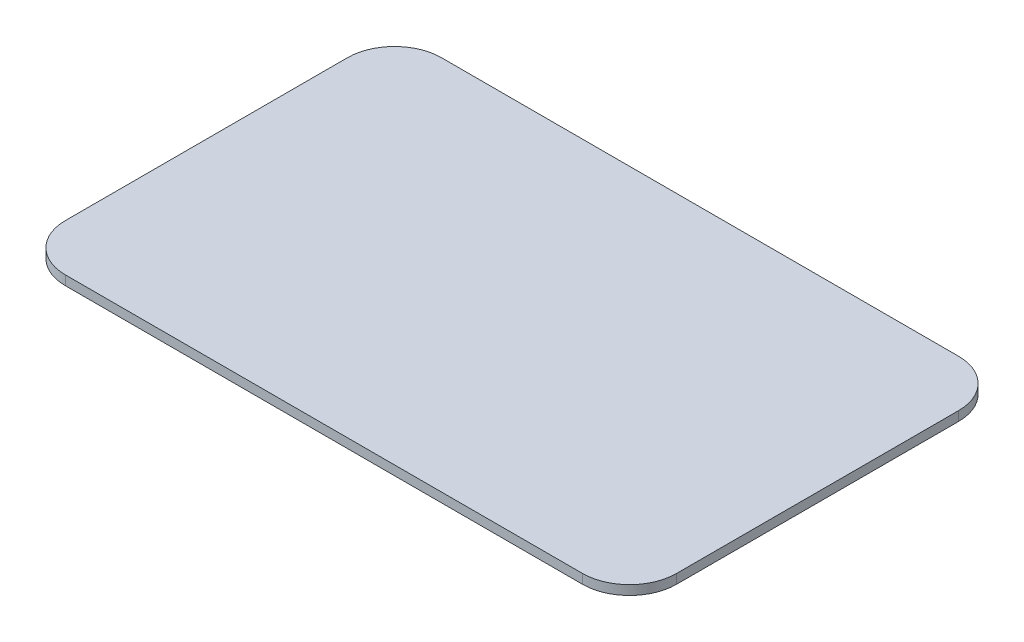
ISO-10303-21;
HEADER;
FILE_DESCRIPTION(('STEP AP214'),'2;1');
FILE_NAME('part.step','',(''),(''),'','','');
FILE_SCHEMA(('AUTOMOTIVE_DESIGN { 1 0 10303 214 1 1 1 1 }'));
ENDSEC;
DATA;
#1=APPLICATION_CONTEXT('core data for automotive mechanical design processes');
#2=APPLICATION_PROTOCOL_DEFINITION('international standard','automotive_design',2000,#1);
#3=PRODUCT_CONTEXT('',#1,'mechanical');
#4=PRODUCT('Part','Part','',(#3));
#5=PRODUCT_RELATED_PRODUCT_CATEGORY('part','',(#4));
#6=PRODUCT_DEFINITION_FORMATION('','',#4);
#7=PRODUCT_DEFINITION_CONTEXT('part definition',#1,'design');
#8=PRODUCT_DEFINITION('design','',#6,#7);
#9=PRODUCT_DEFINITION_SHAPE('','',#8);
#10=(LENGTH_UNIT() NAMED_UNIT(*) SI_UNIT(.MILLI.,.METRE.));
#11=(NAMED_UNIT(*) PLANE_ANGLE_UNIT() SI_UNIT($,.RADIAN.));
#12=(NAMED_UNIT(*) SI_UNIT($,.STERADIAN.) SOLID_ANGLE_UNIT());
#13=UNCERTAINTY_MEASURE_WITH_UNIT(LENGTH_MEASURE(1.E-05),#10,'distance_accuracy_value','');
#14=(GEOMETRIC_REPRESENTATION_CONTEXT(3) GLOBAL_UNCERTAINTY_ASSIGNED_CONTEXT((#13)) GLOBAL_UNIT_ASSIGNED_CONTEXT((#10,
#11,#12)) REPRESENTATION_CONTEXT('',''));
#15=CARTESIAN_POINT('',(0.,0.,0.));
#16=DIRECTION('',(0.,0.,1.));
#17=DIRECTION('',(1.,0.,0.));
#18=AXIS2_PLACEMENT_3D('',#15,#16,#17);
#19=CARTESIAN_POINT('',(-54.5065891010215,2.,30.328940599319));
#20=DIRECTION('',(0.,-1.,0.));
#21=DIRECTION('',(0.,0.,-1.));
#22=AXIS2_PLACEMENT_3D('',#19,#20,#21);
#23=CYLINDRICAL_SURFACE('',#22,10.);
#24=CARTESIAN_POINT('',(-54.5065891010215,0.,30.328940599319));
#25=DIRECTION('',(0.,1.,0.));
#26=DIRECTION('',(0.,0.,1.));
#27=AXIS2_PLACEMENT_3D('',#24,#25,#26);
#28=CIRCLE('',#27,10.);
#29=CARTESIAN_POINT('',(-64.5065891010215,0.,30.3289405993189));
#30=VERTEX_POINT('',#29);
#31=CARTESIAN_POINT('',(-54.5065891010214,0.,40.328940599319));
#32=VERTEX_POINT('',#31);
#33=EDGE_CURVE('E134',#30,#32,#28,.T.);
#34=ORIENTED_EDGE('',*,*,#33,.T.);
#35=DIRECTION('',(0.,-1.,0.));
#36=VECTOR('',#35,1.);
#37=CARTESIAN_POINT('',(-54.5065891010214,2.,40.328940599319));
#38=LINE('',#37,#36);
#39=CARTESIAN_POINT('',(-54.5065891010214,2.,40.328940599319));
#40=VERTEX_POINT('',#39);
#41=EDGE_CURVE('E11',#40,#32,#38,.T.);
#42=ORIENTED_EDGE('',*,*,#41,.F.);
#43=CARTESIAN_POINT('',(-54.5065891010215,2.,30.328940599319));
#44=DIRECTION('',(0.,1.,0.));
#45=DIRECTION('',(0.,0.,1.));
#46=AXIS2_PLACEMENT_3D('',#43,#44,#45);
#47=CIRCLE('',#46,10.);
#48=CARTESIAN_POINT('',(-64.5065891010215,2.,30.3289405993189));
#49=VERTEX_POINT('',#48);
#50=EDGE_CURVE('E146',#49,#40,#47,.T.);
#51=ORIENTED_EDGE('',*,*,#50,.F.);
#52=DIRECTION('',(0.,-1.,0.));
#53=VECTOR('',#52,1.);
#54=CARTESIAN_POINT('',(-64.5065891010215,2.,30.3289405993189));
#55=LINE('',#54,#53);
#56=EDGE_CURVE('E131',#49,#30,#55,.T.);
#57=ORIENTED_EDGE('',*,*,#56,.T.);
#58=EDGE_LOOP('',(#34,#42,#51,#57));
#59=FACE_BOUND('',#58,.T.);
#60=ADVANCED_FACE('F39',(#59),#23,.T.);
#61=CARTESIAN_POINT('',(-54.5065891010214,2.,40.328940599319));
#62=DIRECTION('',(0.,0.,-1.));
#63=DIRECTION('',(-1.,0.,0.));
#64=AXIS2_PLACEMENT_3D('',#61,#62,#63);
#65=PLANE('',#64);
#66=DIRECTION('',(1.,0.,0.));
#67=VECTOR('',#66,1.);
#68=CARTESIAN_POINT('',(-54.5065891010214,0.,40.328940599319));
#69=LINE('',#68,#67);
#70=CARTESIAN_POINT('',(55.4934108989785,0.,40.328940599319));
#71=VERTEX_POINT('',#70);
#72=EDGE_CURVE('E138',#32,#71,#69,.T.);
#73=ORIENTED_EDGE('',*,*,#72,.T.);
#74=DIRECTION('',(0.,-1.,0.));
#75=VECTOR('',#74,1.);
#76=CARTESIAN_POINT('',(55.4934108989785,2.,40.328940599319));
#77=LINE('',#76,#75);
#78=CARTESIAN_POINT('',(55.4934108989785,2.,40.328940599319));
#79=VERTEX_POINT('',#78);
#80=EDGE_CURVE('E50',#79,#71,#77,.T.);
#81=ORIENTED_EDGE('',*,*,#80,.F.);
#82=DIRECTION('',(1.,0.,0.));
#83=VECTOR('',#82,1.);
#84=CARTESIAN_POINT('',(-54.5065891010214,2.,40.328940599319));
#85=LINE('',#84,#83);
#86=EDGE_CURVE('E97',#40,#79,#85,.T.);
#87=ORIENTED_EDGE('',*,*,#86,.F.);
#88=ORIENTED_EDGE('',*,*,#41,.T.);
#89=EDGE_LOOP('',(#73,#81,#87,#88));
#90=FACE_BOUND('',#89,.T.);
#91=ADVANCED_FACE('F182',(#90),#65,.F.);
#92=CARTESIAN_POINT('',(55.4934108989785,2.,30.328940599319));
#93=DIRECTION('',(0.,-1.,0.));
#94=DIRECTION('',(0.,0.,-1.));
#95=AXIS2_PLACEMENT_3D('',#92,#93,#94);
#96=CYLINDRICAL_SURFACE('',#95,10.);
#97=CARTESIAN_POINT('',(55.4934108989785,0.,30.328940599319));
#98=DIRECTION('',(0.,1.,0.));
#99=DIRECTION('',(0.,0.,1.));
#100=AXIS2_PLACEMENT_3D('',#97,#98,#99);
#101=CIRCLE('',#100,10.);
#102=CARTESIAN_POINT('',(65.4934108989785,0.,30.3289405993189));
#103=VERTEX_POINT('',#102);
#104=EDGE_CURVE('E139',#71,#103,#101,.T.);
#105=ORIENTED_EDGE('',*,*,#104,.T.);
#106=DIRECTION('',(0.,-1.,0.));
#107=VECTOR('',#106,1.);
#108=CARTESIAN_POINT('',(65.4934108989785,2.,30.3289405993189));
#109=LINE('',#108,#107);
#110=CARTESIAN_POINT('',(65.4934108989785,2.,30.3289405993189));
#111=VERTEX_POINT('',#110);
#112=EDGE_CURVE('E157',#111,#103,#109,.T.);
#113=ORIENTED_EDGE('',*,*,#112,.F.);
#114=CARTESIAN_POINT('',(55.4934108989785,2.,30.328940599319));
#115=DIRECTION('',(0.,1.,0.));
#116=DIRECTION('',(0.,0.,1.));
#117=AXIS2_PLACEMENT_3D('',#114,#115,#116);
#118=CIRCLE('',#117,10.);
#119=EDGE_CURVE('E163',#79,#111,#118,.T.);
#120=ORIENTED_EDGE('',*,*,#119,.F.);
#121=ORIENTED_EDGE('',*,*,#80,.T.);
#122=EDGE_LOOP('',(#105,#113,#120,#121));
#123=FACE_BOUND('',#122,.T.);
#124=ADVANCED_FACE('F162',(#123),#96,.T.);
#125=CARTESIAN_POINT('',(65.4934108989785,2.,30.3289405993189));
#126=DIRECTION('',(-1.,0.,0.));
#127=DIRECTION('',(0.,0.,1.));
#128=AXIS2_PLACEMENT_3D('',#125,#126,#127);
#129=PLANE('',#128);
#130=DIRECTION('',(0.,0.,-1.));
#131=VECTOR('',#130,1.);
#132=CARTESIAN_POINT('',(65.4934108989785,0.,30.3289405993189));
#133=LINE('',#132,#131);
#134=CARTESIAN_POINT('',(65.4934108989785,0.,-29.6710594006809));
#135=VERTEX_POINT('',#134);
#136=EDGE_CURVE('E145',#103,#135,#133,.T.);
#137=ORIENTED_EDGE('',*,*,#136,.T.);
#138=DIRECTION('',(0.,-1.,0.));
#139=VECTOR('',#138,1.);
#140=CARTESIAN_POINT('',(65.4934108989785,2.,-29.6710594006809));
#141=LINE('',#140,#139);
#142=CARTESIAN_POINT('',(65.4934108989785,2.,-29.6710594006809));
#143=VERTEX_POINT('',#142);
#144=EDGE_CURVE('E154',#143,#135,#141,.T.);
#145=ORIENTED_EDGE('',*,*,#144,.F.);
#146=DIRECTION('',(0.,0.,-1.));
#147=VECTOR('',#146,1.);
#148=CARTESIAN_POINT('',(65.4934108989785,2.,30.3289405993189));
#149=LINE('',#148,#147);
#150=EDGE_CURVE('E176',#111,#143,#149,.T.);
#151=ORIENTED_EDGE('',*,*,#150,.F.);
#152=ORIENTED_EDGE('',*,*,#112,.T.);
#153=EDGE_LOOP('',(#137,#145,#151,#152));
#154=FACE_BOUND('',#153,.T.);
#155=ADVANCED_FACE('F175',(#154),#129,.F.);
#156=CARTESIAN_POINT('',(55.4934108989785,2.,-29.671059400681));
#157=DIRECTION('',(0.,-1.,0.));
#158=DIRECTION('',(0.,0.,-1.));
#159=AXIS2_PLACEMENT_3D('',#156,#157,#158);
#160=CYLINDRICAL_SURFACE('',#159,10.);
#161=CARTESIAN_POINT('',(55.4934108989785,0.,-29.671059400681));
#162=DIRECTION('',(0.,1.,0.));
#163=DIRECTION('',(0.,0.,1.));
#164=AXIS2_PLACEMENT_3D('',#161,#162,#163);
#165=CIRCLE('',#164,10.);
#166=CARTESIAN_POINT('',(55.4934108989785,0.,-39.671059400681));
#167=VERTEX_POINT('',#166);
#168=EDGE_CURVE('E143',#135,#167,#165,.T.);
#169=ORIENTED_EDGE('',*,*,#168,.T.);
#170=DIRECTION('',(0.,-1.,0.));
#171=VECTOR('',#170,1.);
#172=CARTESIAN_POINT('',(55.4934108989785,2.,-39.671059400681));
#173=LINE('',#172,#171);
#174=CARTESIAN_POINT('',(55.4934108989785,2.,-39.671059400681));
#175=VERTEX_POINT('',#174);
#176=EDGE_CURVE('E128',#175,#167,#173,.T.);
#177=ORIENTED_EDGE('',*,*,#176,.F.);
#178=CARTESIAN_POINT('',(55.4934108989785,2.,-29.671059400681));
#179=DIRECTION('',(0.,1.,0.));
#180=DIRECTION('',(0.,0.,1.));
#181=AXIS2_PLACEMENT_3D('',#178,#179,#180);
#182=CIRCLE('',#181,10.);
#183=EDGE_CURVE('E117',#143,#175,#182,.T.);
#184=ORIENTED_EDGE('',*,*,#183,.F.);
#185=ORIENTED_EDGE('',*,*,#144,.T.);
#186=EDGE_LOOP('',(#169,#177,#184,#185));
#187=FACE_BOUND('',#186,.T.);
#188=ADVANCED_FACE('F172',(#187),#160,.T.);
#189=CARTESIAN_POINT('',(55.4934108989785,2.,-39.671059400681));
#190=DIRECTION('',(0.,0.,1.));
#191=DIRECTION('',(1.,0.,0.));
#192=AXIS2_PLACEMENT_3D('',#189,#190,#191);
#193=PLANE('',#192);
#194=DIRECTION('',(-1.,0.,0.));
#195=VECTOR('',#194,1.);
#196=CARTESIAN_POINT('',(55.4934108989785,0.,-39.671059400681));
#197=LINE('',#196,#195);
#198=CARTESIAN_POINT('',(-54.5065891010214,0.,-39.671059400681));
#199=VERTEX_POINT('',#198);
#200=EDGE_CURVE('E124',#167,#199,#197,.T.);
#201=ORIENTED_EDGE('',*,*,#200,.T.);
#202=DIRECTION('',(0.,-1.,0.));
#203=VECTOR('',#202,1.);
#204=CARTESIAN_POINT('',(-54.5065891010214,2.,-39.671059400681));
#205=LINE('',#204,#203);
#206=CARTESIAN_POINT('',(-54.5065891010214,2.,-39.671059400681));
#207=VERTEX_POINT('',#206);
#208=EDGE_CURVE('E122',#207,#199,#205,.T.);
#209=ORIENTED_EDGE('',*,*,#208,.F.);
#210=DIRECTION('',(-1.,0.,0.));
#211=VECTOR('',#210,1.);
#212=CARTESIAN_POINT('',(55.4934108989785,2.,-39.671059400681));
#213=LINE('',#212,#211);
#214=EDGE_CURVE('E112',#175,#207,#213,.T.);
#215=ORIENTED_EDGE('',*,*,#214,.F.);
#216=ORIENTED_EDGE('',*,*,#176,.T.);
#217=EDGE_LOOP('',(#201,#209,#215,#216));
#218=FACE_BOUND('',#217,.T.);
#219=ADVANCED_FACE('F121',(#218),#193,.F.);
#220=CARTESIAN_POINT('',(-54.5065891010215,2.,-29.671059400681));
#221=DIRECTION('',(0.,-1.,0.));
#222=DIRECTION('',(0.,0.,-1.));
#223=AXIS2_PLACEMENT_3D('',#220,#221,#222);
#224=CYLINDRICAL_SURFACE('',#223,10.);
#225=CARTESIAN_POINT('',(-54.5065891010215,0.,-29.671059400681));
#226=DIRECTION('',(0.,1.,0.));
#227=DIRECTION('',(0.,0.,1.));
#228=AXIS2_PLACEMENT_3D('',#225,#226,#227);
#229=CIRCLE('',#228,10.);
#230=CARTESIAN_POINT('',(-64.5065891010215,0.,-29.6710594006809));
#231=VERTEX_POINT('',#230);
#232=EDGE_CURVE('E84',#199,#231,#229,.T.);
#233=ORIENTED_EDGE('',*,*,#232,.T.);
#234=DIRECTION('',(0.,-1.,0.));
#235=VECTOR('',#234,1.);
#236=CARTESIAN_POINT('',(-64.5065891010215,2.,-29.6710594006809));
#237=LINE('',#236,#235);
#238=CARTESIAN_POINT('',(-64.5065891010215,2.,-29.6710594006809));
#239=VERTEX_POINT('',#238);
#240=EDGE_CURVE('E130',#239,#231,#237,.T.);
#241=ORIENTED_EDGE('',*,*,#240,.F.);
#242=CARTESIAN_POINT('',(-54.5065891010215,2.,-29.671059400681));
#243=DIRECTION('',(0.,1.,0.));
#244=DIRECTION('',(0.,0.,1.));
#245=AXIS2_PLACEMENT_3D('',#242,#243,#244);
#246=CIRCLE('',#245,10.);
#247=EDGE_CURVE('E113',#207,#239,#246,.T.);
#248=ORIENTED_EDGE('',*,*,#247,.F.);
#249=ORIENTED_EDGE('',*,*,#208,.T.);
#250=EDGE_LOOP('',(#233,#241,#248,#249));
#251=FACE_BOUND('',#250,.T.);
#252=ADVANCED_FACE('F129',(#251),#224,.T.);
#253=CARTESIAN_POINT('',(-64.5065891010215,2.,-29.6710594006809));
#254=DIRECTION('',(1.,0.,0.));
#255=DIRECTION('',(0.,0.,-1.));
#256=AXIS2_PLACEMENT_3D('',#253,#254,#255);
#257=PLANE('',#256);
#258=DIRECTION('',(0.,0.,1.));
#259=VECTOR('',#258,1.);
#260=CARTESIAN_POINT('',(-64.5065891010215,0.,-29.6710594006809));
#261=LINE('',#260,#259);
#262=EDGE_CURVE('E89',#231,#30,#261,.T.);
#263=ORIENTED_EDGE('',*,*,#262,.T.);
#264=ORIENTED_EDGE('',*,*,#56,.F.);
#265=DIRECTION('',(0.,0.,1.));
#266=VECTOR('',#265,1.);
#267=CARTESIAN_POINT('',(-64.5065891010215,2.,-29.6710594006809));
#268=LINE('',#267,#266);
#269=EDGE_CURVE('E54',#239,#49,#268,.T.);
#270=ORIENTED_EDGE('',*,*,#269,.F.);
#271=ORIENTED_EDGE('',*,*,#240,.T.);
#272=EDGE_LOOP('',(#263,#264,#270,#271));
#273=FACE_BOUND('',#272,.T.);
#274=ADVANCED_FACE('F200',(#273),#257,.F.);
#275=CARTESIAN_POINT('',(-54.5065891010215,2.,30.328940599319));
#276=DIRECTION('',(0.,1.,0.));
#277=DIRECTION('',(0.,0.,1.));
#278=AXIS2_PLACEMENT_3D('',#275,#276,#277);
#279=PLANE('',#278);
#280=ORIENTED_EDGE('',*,*,#50,.T.);
#281=ORIENTED_EDGE('',*,*,#86,.T.);
#282=ORIENTED_EDGE('',*,*,#119,.T.);
#283=ORIENTED_EDGE('',*,*,#150,.T.);
#284=ORIENTED_EDGE('',*,*,#183,.T.);
#285=ORIENTED_EDGE('',*,*,#214,.T.);
#286=ORIENTED_EDGE('',*,*,#247,.T.);
#287=ORIENTED_EDGE('',*,*,#269,.T.);
#288=EDGE_LOOP('',(#280,#281,#282,#283,#284,#285,#286,#287));
#289=FACE_BOUND('',#288,.T.);
#290=ADVANCED_FACE('F111',(#289),#279,.T.);
#291=CARTESIAN_POINT('',(-54.5065891010215,0.,30.328940599319));
#292=DIRECTION('',(0.,1.,0.));
#293=DIRECTION('',(0.,0.,1.));
#294=AXIS2_PLACEMENT_3D('',#291,#292,#293);
#295=PLANE('',#294);
#296=ORIENTED_EDGE('',*,*,#33,.F.);
#297=ORIENTED_EDGE('',*,*,#262,.F.);
#298=ORIENTED_EDGE('',*,*,#232,.F.);
#299=ORIENTED_EDGE('',*,*,#200,.F.);
#300=ORIENTED_EDGE('',*,*,#168,.F.);
#301=ORIENTED_EDGE('',*,*,#136,.F.);
#302=ORIENTED_EDGE('',*,*,#104,.F.);
#303=ORIENTED_EDGE('',*,*,#72,.F.);
#304=EDGE_LOOP('',(#296,#297,#298,#299,#300,#301,#302,#303));
#305=FACE_BOUND('',#304,.T.);
#306=ADVANCED_FACE('F166',(#305),#295,.F.);
#307=CLOSED_SHELL('',(#60,#91,#124,#155,#188,#219,#252,#274,#290,#306));
#308=MANIFOLD_SOLID_BREP('B2',#307);
#309=ADVANCED_BREP_SHAPE_REPRESENTATION('',(#18,#308),#14);
#310=SHAPE_DEFINITION_REPRESENTATION(#9,#309);
ENDSEC;
END-ISO-10303-21;
